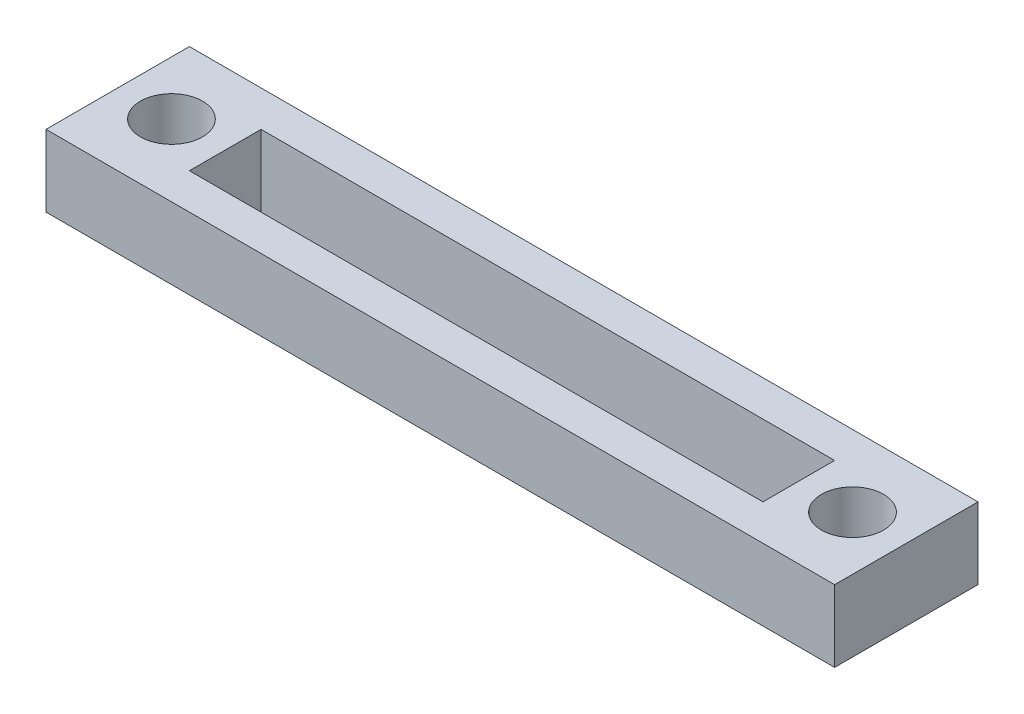
ISO-10303-21;
HEADER;
FILE_DESCRIPTION(('STEP AP214'),'2;1');
FILE_NAME('part.step','',(''),(''),'','','');
FILE_SCHEMA(('AUTOMOTIVE_DESIGN { 1 0 10303 214 1 1 1 1 }'));
ENDSEC;
DATA;
#1=APPLICATION_CONTEXT('core data for automotive mechanical design processes');
#2=APPLICATION_PROTOCOL_DEFINITION('international standard','automotive_design',2000,#1);
#3=PRODUCT_CONTEXT('',#1,'mechanical');
#4=PRODUCT('Part','Part','',(#3));
#5=PRODUCT_RELATED_PRODUCT_CATEGORY('part','',(#4));
#6=PRODUCT_DEFINITION_FORMATION('','',#4);
#7=PRODUCT_DEFINITION_CONTEXT('part definition',#1,'design');
#8=PRODUCT_DEFINITION('design','',#6,#7);
#9=PRODUCT_DEFINITION_SHAPE('','',#8);
#10=(LENGTH_UNIT() NAMED_UNIT(*) SI_UNIT(.MILLI.,.METRE.));
#11=(NAMED_UNIT(*) PLANE_ANGLE_UNIT() SI_UNIT($,.RADIAN.));
#12=(NAMED_UNIT(*) SI_UNIT($,.STERADIAN.) SOLID_ANGLE_UNIT());
#13=UNCERTAINTY_MEASURE_WITH_UNIT(LENGTH_MEASURE(1.E-05),#10,'distance_accuracy_value','');
#14=(GEOMETRIC_REPRESENTATION_CONTEXT(3) GLOBAL_UNCERTAINTY_ASSIGNED_CONTEXT((#13)) GLOBAL_UNIT_ASSIGNED_CONTEXT((#10,
#11,#12)) REPRESENTATION_CONTEXT('',''));
#15=CARTESIAN_POINT('',(0.,0.,0.));
#16=DIRECTION('',(0.,0.,1.));
#17=DIRECTION('',(1.,0.,0.));
#18=AXIS2_PLACEMENT_3D('',#15,#16,#17);
#19=CARTESIAN_POINT('',(0.,6.35,0.));
#20=DIRECTION('',(0.,-1.,0.));
#21=DIRECTION('',(0.,0.,-1.));
#22=AXIS2_PLACEMENT_3D('',#19,#20,#21);
#23=PLANE('',#22);
#24=CARTESIAN_POINT('',(-30.1625,6.35,0.));
#25=DIRECTION('',(0.,1.,0.));
#26=DIRECTION('',(0.,0.,1.));
#27=AXIS2_PLACEMENT_3D('',#24,#25,#26);
#28=CIRCLE('',#27,2.75);
#29=CARTESIAN_POINT('',(-30.1625,6.35,2.75));
#30=VERTEX_POINT('',#29);
#31=EDGE_CURVE('E271',#30,#30,#28,.T.);
#32=ORIENTED_EDGE('',*,*,#31,.F.);
#33=EDGE_LOOP('',(#32));
#34=FACE_BOUND('',#33,.T.);
#35=DIRECTION('',(0.,0.,-1.));
#36=VECTOR('',#35,1.);
#37=CARTESIAN_POINT('',(34.925,6.35,6.35));
#38=LINE('',#37,#36);
#39=CARTESIAN_POINT('',(34.925,6.35,6.35));
#40=VERTEX_POINT('',#39);
#41=CARTESIAN_POINT('',(34.925,6.35,-6.35));
#42=VERTEX_POINT('',#41);
#43=EDGE_CURVE('E162',#40,#42,#38,.T.);
#44=ORIENTED_EDGE('',*,*,#43,.T.);
#45=DIRECTION('',(-1.,0.,0.));
#46=VECTOR('',#45,1.);
#47=CARTESIAN_POINT('',(-34.925,6.35,-6.35));
#48=LINE('',#47,#46);
#49=CARTESIAN_POINT('',(-34.925,6.35,-6.35));
#50=VERTEX_POINT('',#49);
#51=EDGE_CURVE('E166',#42,#50,#48,.T.);
#52=ORIENTED_EDGE('',*,*,#51,.T.);
#53=DIRECTION('',(0.,0.,1.));
#54=VECTOR('',#53,1.);
#55=CARTESIAN_POINT('',(-34.925,6.35,6.35));
#56=LINE('',#55,#54);
#57=CARTESIAN_POINT('',(-34.925,6.35,6.35));
#58=VERTEX_POINT('',#57);
#59=EDGE_CURVE('E170',#50,#58,#56,.T.);
#60=ORIENTED_EDGE('',*,*,#59,.T.);
#61=DIRECTION('',(1.,0.,0.));
#62=VECTOR('',#61,1.);
#63=CARTESIAN_POINT('',(-34.925,6.35,6.35));
#64=LINE('',#63,#62);
#65=EDGE_CURVE('E173',#58,#40,#64,.T.);
#66=ORIENTED_EDGE('',*,*,#65,.T.);
#67=EDGE_LOOP('',(#44,#52,#60,#66));
#68=FACE_BOUND('',#67,.T.);
#69=DIRECTION('',(0.,0.,-1.));
#70=VECTOR('',#69,1.);
#71=CARTESIAN_POINT('',(25.4,6.35,3.175));
#72=LINE('',#71,#70);
#73=CARTESIAN_POINT('',(25.4,6.35,3.175));
#74=VERTEX_POINT('',#73);
#75=CARTESIAN_POINT('',(25.4,6.35,-3.175));
#76=VERTEX_POINT('',#75);
#77=EDGE_CURVE('E111',#74,#76,#72,.T.);
#78=ORIENTED_EDGE('',*,*,#77,.F.);
#79=DIRECTION('',(1.,0.,0.));
#80=VECTOR('',#79,1.);
#81=CARTESIAN_POINT('',(-25.4,6.35,3.175));
#82=LINE('',#81,#80);
#83=CARTESIAN_POINT('',(-25.4,6.35,3.175));
#84=VERTEX_POINT('',#83);
#85=EDGE_CURVE('E138',#84,#74,#82,.T.);
#86=ORIENTED_EDGE('',*,*,#85,.F.);
#87=DIRECTION('',(0.,0.,1.));
#88=VECTOR('',#87,1.);
#89=CARTESIAN_POINT('',(-25.4,6.35,3.175));
#90=LINE('',#89,#88);
#91=CARTESIAN_POINT('',(-25.4,6.35,-3.175));
#92=VERTEX_POINT('',#91);
#93=EDGE_CURVE('E134',#92,#84,#90,.T.);
#94=ORIENTED_EDGE('',*,*,#93,.F.);
#95=DIRECTION('',(-1.,0.,0.));
#96=VECTOR('',#95,1.);
#97=CARTESIAN_POINT('',(-25.4,6.35,-3.175));
#98=LINE('',#97,#96);
#99=EDGE_CURVE('E120',#76,#92,#98,.T.);
#100=ORIENTED_EDGE('',*,*,#99,.F.);
#101=EDGE_LOOP('',(#78,#86,#94,#100));
#102=FACE_BOUND('',#101,.T.);
#103=CARTESIAN_POINT('',(30.1625,6.35,0.));
#104=DIRECTION('',(0.,1.,0.));
#105=DIRECTION('',(0.,0.,1.));
#106=AXIS2_PLACEMENT_3D('',#103,#104,#105);
#107=CIRCLE('',#106,2.75);
#108=CARTESIAN_POINT('',(30.1625,6.35,2.75));
#109=VERTEX_POINT('',#108);
#110=EDGE_CURVE('E267',#109,#109,#107,.T.);
#111=ORIENTED_EDGE('',*,*,#110,.F.);
#112=EDGE_LOOP('',(#111));
#113=FACE_BOUND('',#112,.T.);
#114=ADVANCED_FACE('F45',(#34,#68,#102,#113),#23,.F.);
#115=CARTESIAN_POINT('',(0.,0.,0.));
#116=DIRECTION('',(0.,-1.,0.));
#117=DIRECTION('',(0.,0.,-1.));
#118=AXIS2_PLACEMENT_3D('',#115,#116,#117);
#119=PLANE('',#118);
#120=CARTESIAN_POINT('',(30.1625,0.,0.));
#121=DIRECTION('',(0.,1.,0.));
#122=DIRECTION('',(0.,0.,1.));
#123=AXIS2_PLACEMENT_3D('',#120,#121,#122);
#124=CIRCLE('',#123,2.75);
#125=CARTESIAN_POINT('',(30.1625,0.,2.75));
#126=VERTEX_POINT('',#125);
#127=EDGE_CURVE('E264',#126,#126,#124,.T.);
#128=ORIENTED_EDGE('',*,*,#127,.T.);
#129=EDGE_LOOP('',(#128));
#130=FACE_BOUND('',#129,.T.);
#131=CARTESIAN_POINT('',(-30.1625,0.,0.));
#132=DIRECTION('',(0.,1.,0.));
#133=DIRECTION('',(0.,0.,1.));
#134=AXIS2_PLACEMENT_3D('',#131,#132,#133);
#135=CIRCLE('',#134,2.75);
#136=CARTESIAN_POINT('',(-30.1625,0.,2.75));
#137=VERTEX_POINT('',#136);
#138=EDGE_CURVE('E146',#137,#137,#135,.T.);
#139=ORIENTED_EDGE('',*,*,#138,.T.);
#140=EDGE_LOOP('',(#139));
#141=FACE_BOUND('',#140,.T.);
#142=DIRECTION('',(0.,0.,-1.));
#143=VECTOR('',#142,1.);
#144=CARTESIAN_POINT('',(34.925,0.,6.35));
#145=LINE('',#144,#143);
#146=CARTESIAN_POINT('',(34.925,0.,6.35));
#147=VERTEX_POINT('',#146);
#148=CARTESIAN_POINT('',(34.925,0.,-6.35));
#149=VERTEX_POINT('',#148);
#150=EDGE_CURVE('E129',#147,#149,#145,.T.);
#151=ORIENTED_EDGE('',*,*,#150,.F.);
#152=DIRECTION('',(1.,0.,0.));
#153=VECTOR('',#152,1.);
#154=CARTESIAN_POINT('',(-34.925,0.,6.35));
#155=LINE('',#154,#153);
#156=CARTESIAN_POINT('',(-34.925,0.,6.35));
#157=VERTEX_POINT('',#156);
#158=EDGE_CURVE('E167',#157,#147,#155,.T.);
#159=ORIENTED_EDGE('',*,*,#158,.F.);
#160=DIRECTION('',(0.,0.,1.));
#161=VECTOR('',#160,1.);
#162=CARTESIAN_POINT('',(-34.925,0.,6.35));
#163=LINE('',#162,#161);
#164=CARTESIAN_POINT('',(-34.925,0.,-6.35));
#165=VERTEX_POINT('',#164);
#166=EDGE_CURVE('E183',#165,#157,#163,.T.);
#167=ORIENTED_EDGE('',*,*,#166,.F.);
#168=DIRECTION('',(-1.,0.,0.));
#169=VECTOR('',#168,1.);
#170=CARTESIAN_POINT('',(-34.925,0.,-6.35));
#171=LINE('',#170,#169);
#172=EDGE_CURVE('E180',#149,#165,#171,.T.);
#173=ORIENTED_EDGE('',*,*,#172,.F.);
#174=EDGE_LOOP('',(#151,#159,#167,#173));
#175=FACE_BOUND('',#174,.T.);
#176=DIRECTION('',(1.,0.,0.));
#177=VECTOR('',#176,1.);
#178=CARTESIAN_POINT('',(-25.4,0.,3.175));
#179=LINE('',#178,#177);
#180=CARTESIAN_POINT('',(-25.4,0.,3.175));
#181=VERTEX_POINT('',#180);
#182=CARTESIAN_POINT('',(25.4,0.,3.175));
#183=VERTEX_POINT('',#182);
#184=EDGE_CURVE('E121',#181,#183,#179,.T.);
#185=ORIENTED_EDGE('',*,*,#184,.T.);
#186=DIRECTION('',(0.,0.,-1.));
#187=VECTOR('',#186,1.);
#188=CARTESIAN_POINT('',(25.4,0.,3.175));
#189=LINE('',#188,#187);
#190=CARTESIAN_POINT('',(25.4,0.,-3.175));
#191=VERTEX_POINT('',#190);
#192=EDGE_CURVE('E69',#183,#191,#189,.T.);
#193=ORIENTED_EDGE('',*,*,#192,.T.);
#194=DIRECTION('',(-1.,0.,0.));
#195=VECTOR('',#194,1.);
#196=CARTESIAN_POINT('',(-25.4,0.,-3.175));
#197=LINE('',#196,#195);
#198=CARTESIAN_POINT('',(-25.4,0.,-3.175));
#199=VERTEX_POINT('',#198);
#200=EDGE_CURVE('E127',#191,#199,#197,.T.);
#201=ORIENTED_EDGE('',*,*,#200,.T.);
#202=DIRECTION('',(0.,0.,1.));
#203=VECTOR('',#202,1.);
#204=CARTESIAN_POINT('',(-25.4,0.,3.175));
#205=LINE('',#204,#203);
#206=EDGE_CURVE('E149',#199,#181,#205,.T.);
#207=ORIENTED_EDGE('',*,*,#206,.T.);
#208=EDGE_LOOP('',(#185,#193,#201,#207));
#209=FACE_BOUND('',#208,.T.);
#210=ADVANCED_FACE('F206',(#130,#141,#175,#209),#119,.T.);
#211=CARTESIAN_POINT('',(34.925,6.35,6.35));
#212=DIRECTION('',(-1.,0.,0.));
#213=DIRECTION('',(0.,0.,1.));
#214=AXIS2_PLACEMENT_3D('',#211,#212,#213);
#215=PLANE('',#214);
#216=ORIENTED_EDGE('',*,*,#150,.T.);
#217=DIRECTION('',(0.,-1.,0.));
#218=VECTOR('',#217,1.);
#219=CARTESIAN_POINT('',(34.925,6.35,-6.35));
#220=LINE('',#219,#218);
#221=EDGE_CURVE('E11',#42,#149,#220,.T.);
#222=ORIENTED_EDGE('',*,*,#221,.F.);
#223=ORIENTED_EDGE('',*,*,#43,.F.);
#224=DIRECTION('',(0.,-1.,0.));
#225=VECTOR('',#224,1.);
#226=CARTESIAN_POINT('',(34.925,6.35,6.35));
#227=LINE('',#226,#225);
#228=EDGE_CURVE('E176',#40,#147,#227,.T.);
#229=ORIENTED_EDGE('',*,*,#228,.T.);
#230=EDGE_LOOP('',(#216,#222,#223,#229));
#231=FACE_BOUND('',#230,.T.);
#232=ADVANCED_FACE('F47',(#231),#215,.F.);
#233=CARTESIAN_POINT('',(-34.925,6.35,-6.35));
#234=DIRECTION('',(0.,0.,1.));
#235=DIRECTION('',(1.,0.,0.));
#236=AXIS2_PLACEMENT_3D('',#233,#234,#235);
#237=PLANE('',#236);
#238=ORIENTED_EDGE('',*,*,#172,.T.);
#239=DIRECTION('',(0.,-1.,0.));
#240=VECTOR('',#239,1.);
#241=CARTESIAN_POINT('',(-34.925,6.35,-6.35));
#242=LINE('',#241,#240);
#243=EDGE_CURVE('E54',#50,#165,#242,.T.);
#244=ORIENTED_EDGE('',*,*,#243,.F.);
#245=ORIENTED_EDGE('',*,*,#51,.F.);
#246=ORIENTED_EDGE('',*,*,#221,.T.);
#247=EDGE_LOOP('',(#238,#244,#245,#246));
#248=FACE_BOUND('',#247,.T.);
#249=ADVANCED_FACE('F216',(#248),#237,.F.);
#250=CARTESIAN_POINT('',(-34.925,6.35,6.35));
#251=DIRECTION('',(1.,0.,0.));
#252=DIRECTION('',(0.,0.,-1.));
#253=AXIS2_PLACEMENT_3D('',#250,#251,#252);
#254=PLANE('',#253);
#255=ORIENTED_EDGE('',*,*,#166,.T.);
#256=DIRECTION('',(0.,-1.,0.));
#257=VECTOR('',#256,1.);
#258=CARTESIAN_POINT('',(-34.925,6.35,6.35));
#259=LINE('',#258,#257);
#260=EDGE_CURVE('E191',#58,#157,#259,.T.);
#261=ORIENTED_EDGE('',*,*,#260,.F.);
#262=ORIENTED_EDGE('',*,*,#59,.F.);
#263=ORIENTED_EDGE('',*,*,#243,.T.);
#264=EDGE_LOOP('',(#255,#261,#262,#263));
#265=FACE_BOUND('',#264,.T.);
#266=ADVANCED_FACE('F200',(#265),#254,.F.);
#267=CARTESIAN_POINT('',(-34.925,6.35,6.35));
#268=DIRECTION('',(0.,0.,-1.));
#269=DIRECTION('',(-1.,0.,0.));
#270=AXIS2_PLACEMENT_3D('',#267,#268,#269);
#271=PLANE('',#270);
#272=ORIENTED_EDGE('',*,*,#158,.T.);
#273=ORIENTED_EDGE('',*,*,#228,.F.);
#274=ORIENTED_EDGE('',*,*,#65,.F.);
#275=ORIENTED_EDGE('',*,*,#260,.T.);
#276=EDGE_LOOP('',(#272,#273,#274,#275));
#277=FACE_BOUND('',#276,.T.);
#278=ADVANCED_FACE('F210',(#277),#271,.F.);
#279=CARTESIAN_POINT('',(25.4,6.35,3.175));
#280=DIRECTION('',(-1.,0.,0.));
#281=DIRECTION('',(0.,0.,1.));
#282=AXIS2_PLACEMENT_3D('',#279,#280,#281);
#283=PLANE('',#282);
#284=ORIENTED_EDGE('',*,*,#192,.F.);
#285=DIRECTION('',(0.,-1.,0.));
#286=VECTOR('',#285,1.);
#287=CARTESIAN_POINT('',(25.4,6.35,3.175));
#288=LINE('',#287,#286);
#289=EDGE_CURVE('E115',#74,#183,#288,.T.);
#290=ORIENTED_EDGE('',*,*,#289,.F.);
#291=ORIENTED_EDGE('',*,*,#77,.T.);
#292=DIRECTION('',(0.,-1.,0.));
#293=VECTOR('',#292,1.);
#294=CARTESIAN_POINT('',(25.4,6.35,-3.175));
#295=LINE('',#294,#293);
#296=EDGE_CURVE('E114',#76,#191,#295,.T.);
#297=ORIENTED_EDGE('',*,*,#296,.T.);
#298=EDGE_LOOP('',(#284,#290,#291,#297));
#299=FACE_BOUND('',#298,.T.);
#300=ADVANCED_FACE('F113',(#299),#283,.T.);
#301=CARTESIAN_POINT('',(-25.4,6.35,-3.175));
#302=DIRECTION('',(0.,0.,1.));
#303=DIRECTION('',(1.,0.,0.));
#304=AXIS2_PLACEMENT_3D('',#301,#302,#303);
#305=PLANE('',#304);
#306=ORIENTED_EDGE('',*,*,#200,.F.);
#307=ORIENTED_EDGE('',*,*,#296,.F.);
#308=ORIENTED_EDGE('',*,*,#99,.T.);
#309=DIRECTION('',(0.,-1.,0.));
#310=VECTOR('',#309,1.);
#311=CARTESIAN_POINT('',(-25.4,6.35,-3.175));
#312=LINE('',#311,#310);
#313=EDGE_CURVE('E130',#92,#199,#312,.T.);
#314=ORIENTED_EDGE('',*,*,#313,.T.);
#315=EDGE_LOOP('',(#306,#307,#308,#314));
#316=FACE_BOUND('',#315,.T.);
#317=ADVANCED_FACE('F124',(#316),#305,.T.);
#318=CARTESIAN_POINT('',(-25.4,6.35,3.175));
#319=DIRECTION('',(1.,0.,0.));
#320=DIRECTION('',(0.,0.,-1.));
#321=AXIS2_PLACEMENT_3D('',#318,#319,#320);
#322=PLANE('',#321);
#323=ORIENTED_EDGE('',*,*,#206,.F.);
#324=ORIENTED_EDGE('',*,*,#313,.F.);
#325=ORIENTED_EDGE('',*,*,#93,.T.);
#326=DIRECTION('',(0.,-1.,0.));
#327=VECTOR('',#326,1.);
#328=CARTESIAN_POINT('',(-25.4,6.35,3.175));
#329=LINE('',#328,#327);
#330=EDGE_CURVE('E61',#84,#181,#329,.T.);
#331=ORIENTED_EDGE('',*,*,#330,.T.);
#332=EDGE_LOOP('',(#323,#324,#325,#331));
#333=FACE_BOUND('',#332,.T.);
#334=ADVANCED_FACE('F242',(#333),#322,.T.);
#335=CARTESIAN_POINT('',(-25.4,6.35,3.175));
#336=DIRECTION('',(0.,0.,-1.));
#337=DIRECTION('',(-1.,0.,0.));
#338=AXIS2_PLACEMENT_3D('',#335,#336,#337);
#339=PLANE('',#338);
#340=ORIENTED_EDGE('',*,*,#184,.F.);
#341=ORIENTED_EDGE('',*,*,#330,.F.);
#342=ORIENTED_EDGE('',*,*,#85,.T.);
#343=ORIENTED_EDGE('',*,*,#289,.T.);
#344=EDGE_LOOP('',(#340,#341,#342,#343));
#345=FACE_BOUND('',#344,.T.);
#346=ADVANCED_FACE('F246',(#345),#339,.T.);
#347=CARTESIAN_POINT('',(-30.1625,6.35,0.));
#348=DIRECTION('',(0.,1.,0.));
#349=DIRECTION('',(0.,0.,1.));
#350=AXIS2_PLACEMENT_3D('',#347,#348,#349);
#351=CYLINDRICAL_SURFACE('',#350,2.75);
#352=ORIENTED_EDGE('',*,*,#138,.F.);
#353=EDGE_LOOP('',(#352));
#354=FACE_BOUND('',#353,.T.);
#355=ORIENTED_EDGE('',*,*,#31,.T.);
#356=EDGE_LOOP('',(#355));
#357=FACE_BOUND('',#356,.T.);
#358=ADVANCED_FACE('F252',(#354,#357),#351,.F.);
#359=CARTESIAN_POINT('',(30.1625,6.35,0.));
#360=DIRECTION('',(0.,1.,0.));
#361=DIRECTION('',(0.,0.,1.));
#362=AXIS2_PLACEMENT_3D('',#359,#360,#361);
#363=CYLINDRICAL_SURFACE('',#362,2.75);
#364=ORIENTED_EDGE('',*,*,#127,.F.);
#365=EDGE_LOOP('',(#364));
#366=FACE_BOUND('',#365,.T.);
#367=ORIENTED_EDGE('',*,*,#110,.T.);
#368=EDGE_LOOP('',(#367));
#369=FACE_BOUND('',#368,.T.);
#370=ADVANCED_FACE('F255',(#366,#369),#363,.F.);
#371=CLOSED_SHELL('',(#114,#210,#232,#249,#266,#278,#300,#317,#334,#346,#358,#370));
#372=MANIFOLD_SOLID_BREP('B2',#371);
#373=ADVANCED_BREP_SHAPE_REPRESENTATION('',(#18,#372),#14);
#374=SHAPE_DEFINITION_REPRESENTATION(#9,#373);
ENDSEC;
END-ISO-10303-21;
